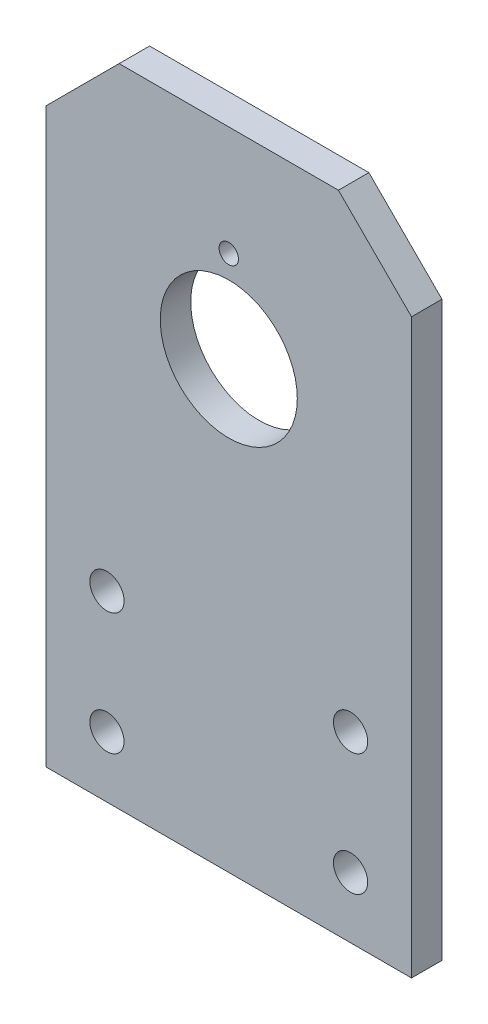
ISO-10303-21;
HEADER;
FILE_DESCRIPTION(('STEP AP214'),'2;1');
FILE_NAME('part.step','',(''),(''),'','','');
FILE_SCHEMA(('AUTOMOTIVE_DESIGN { 1 0 10303 214 1 1 1 1 }'));
ENDSEC;
DATA;
#1=APPLICATION_CONTEXT('core data for automotive mechanical design processes');
#2=APPLICATION_PROTOCOL_DEFINITION('international standard','automotive_design',2000,#1);
#3=PRODUCT_CONTEXT('',#1,'mechanical');
#4=PRODUCT('Part','Part','',(#3));
#5=PRODUCT_RELATED_PRODUCT_CATEGORY('part','',(#4));
#6=PRODUCT_DEFINITION_FORMATION('','',#4);
#7=PRODUCT_DEFINITION_CONTEXT('part definition',#1,'design');
#8=PRODUCT_DEFINITION('design','',#6,#7);
#9=PRODUCT_DEFINITION_SHAPE('','',#8);
#10=(LENGTH_UNIT() NAMED_UNIT(*) SI_UNIT(.MILLI.,.METRE.));
#11=(NAMED_UNIT(*) PLANE_ANGLE_UNIT() SI_UNIT($,.RADIAN.));
#12=(NAMED_UNIT(*) SI_UNIT($,.STERADIAN.) SOLID_ANGLE_UNIT());
#13=UNCERTAINTY_MEASURE_WITH_UNIT(LENGTH_MEASURE(1.E-05),#10,'distance_accuracy_value','');
#14=(GEOMETRIC_REPRESENTATION_CONTEXT(3) GLOBAL_UNCERTAINTY_ASSIGNED_CONTEXT((#13)) GLOBAL_UNIT_ASSIGNED_CONTEXT((#10,
#11,#12)) REPRESENTATION_CONTEXT('',''));
#15=CARTESIAN_POINT('',(0.,0.,0.));
#16=DIRECTION('',(0.,0.,1.));
#17=DIRECTION('',(1.,0.,0.));
#18=AXIS2_PLACEMENT_3D('',#15,#16,#17);
#19=CARTESIAN_POINT('',(0.,0.,6.35));
#20=DIRECTION('',(1.,0.,0.));
#21=DIRECTION('',(0.,1.,0.));
#22=AXIS2_PLACEMENT_3D('',#19,#20,#21);
#23=PLANE('',#22);
#24=DIRECTION('',(0.,-1.,0.));
#25=VECTOR('',#24,1.);
#26=CARTESIAN_POINT('',(0.,0.,6.35));
#27=LINE('',#26,#25);
#28=CARTESIAN_POINT('',(0.,-15.24,6.35));
#29=VERTEX_POINT('',#28);
#30=CARTESIAN_POINT('',(0.,-134.62,6.35));
#31=VERTEX_POINT('',#30);
#32=EDGE_CURVE('E89',#29,#31,#27,.T.);
#33=ORIENTED_EDGE('',*,*,#32,.F.);
#34=DIRECTION('',(0.,0.,-1.));
#35=VECTOR('',#34,1.);
#36=CARTESIAN_POINT('',(0.,-15.24,6.35));
#37=LINE('',#36,#35);
#38=CARTESIAN_POINT('',(0.,-15.24,0.));
#39=VERTEX_POINT('',#38);
#40=EDGE_CURVE('E112',#29,#39,#37,.T.);
#41=ORIENTED_EDGE('',*,*,#40,.T.);
#42=DIRECTION('',(0.,-1.,0.));
#43=VECTOR('',#42,1.);
#44=CARTESIAN_POINT('',(0.,0.,0.));
#45=LINE('',#44,#43);
#46=CARTESIAN_POINT('',(0.,-134.62,0.));
#47=VERTEX_POINT('',#46);
#48=EDGE_CURVE('E110',#39,#47,#45,.T.);
#49=ORIENTED_EDGE('',*,*,#48,.T.);
#50=DIRECTION('',(0.,0.,-1.));
#51=VECTOR('',#50,1.);
#52=CARTESIAN_POINT('',(0.,-134.62,6.35));
#53=LINE('',#52,#51);
#54=EDGE_CURVE('E104',#31,#47,#53,.T.);
#55=ORIENTED_EDGE('',*,*,#54,.F.);
#56=EDGE_LOOP('',(#33,#41,#49,#55));
#57=FACE_BOUND('',#56,.T.);
#58=ADVANCED_FACE('F35',(#57),#23,.F.);
#59=CARTESIAN_POINT('',(0.,-134.62,6.35));
#60=DIRECTION('',(0.,1.,0.));
#61=DIRECTION('',(0.,0.,1.));
#62=AXIS2_PLACEMENT_3D('',#59,#60,#61);
#63=PLANE('',#62);
#64=DIRECTION('',(1.,0.,0.));
#65=VECTOR('',#64,1.);
#66=CARTESIAN_POINT('',(0.,-134.62,0.));
#67=LINE('',#66,#65);
#68=CARTESIAN_POINT('',(76.2,-134.62,0.));
#69=VERTEX_POINT('',#68);
#70=EDGE_CURVE('E139',#47,#69,#67,.T.);
#71=ORIENTED_EDGE('',*,*,#70,.T.);
#72=DIRECTION('',(0.,0.,-1.));
#73=VECTOR('',#72,1.);
#74=CARTESIAN_POINT('',(76.2,-134.62,6.35));
#75=LINE('',#74,#73);
#76=CARTESIAN_POINT('',(76.2,-134.62,6.35));
#77=VERTEX_POINT('',#76);
#78=EDGE_CURVE('E106',#77,#69,#75,.T.);
#79=ORIENTED_EDGE('',*,*,#78,.F.);
#80=DIRECTION('',(1.,0.,0.));
#81=VECTOR('',#80,1.);
#82=CARTESIAN_POINT('',(0.,-134.62,6.35));
#83=LINE('',#82,#81);
#84=EDGE_CURVE('E92',#31,#77,#83,.T.);
#85=ORIENTED_EDGE('',*,*,#84,.F.);
#86=ORIENTED_EDGE('',*,*,#54,.T.);
#87=EDGE_LOOP('',(#71,#79,#85,#86));
#88=FACE_BOUND('',#87,.T.);
#89=ADVANCED_FACE('F103',(#88),#63,.F.);
#90=CARTESIAN_POINT('',(76.2,0.,6.35));
#91=DIRECTION('',(-1.,0.,0.));
#92=DIRECTION('',(0.,0.,1.));
#93=AXIS2_PLACEMENT_3D('',#90,#91,#92);
#94=PLANE('',#93);
#95=DIRECTION('',(0.,1.,0.));
#96=VECTOR('',#95,1.);
#97=CARTESIAN_POINT('',(76.2,0.,0.));
#98=LINE('',#97,#96);
#99=CARTESIAN_POINT('',(76.2,-15.2400000000001,0.));
#100=VERTEX_POINT('',#99);
#101=EDGE_CURVE('E137',#69,#100,#98,.T.);
#102=ORIENTED_EDGE('',*,*,#101,.T.);
#103=DIRECTION('',(0.,0.,1.));
#104=VECTOR('',#103,1.);
#105=CARTESIAN_POINT('',(76.2,-15.2400000000001,6.35));
#106=LINE('',#105,#104);
#107=CARTESIAN_POINT('',(76.2,-15.2400000000001,6.35));
#108=VERTEX_POINT('',#107);
#109=EDGE_CURVE('E11',#100,#108,#106,.T.);
#110=ORIENTED_EDGE('',*,*,#109,.T.);
#111=DIRECTION('',(0.,1.,0.));
#112=VECTOR('',#111,1.);
#113=CARTESIAN_POINT('',(76.2,0.,6.35));
#114=LINE('',#113,#112);
#115=EDGE_CURVE('E107',#77,#108,#114,.T.);
#116=ORIENTED_EDGE('',*,*,#115,.F.);
#117=ORIENTED_EDGE('',*,*,#78,.T.);
#118=EDGE_LOOP('',(#102,#110,#116,#117));
#119=FACE_BOUND('',#118,.T.);
#120=ADVANCED_FACE('F138',(#119),#94,.F.);
#121=CARTESIAN_POINT('',(0.,0.,6.35));
#122=DIRECTION('',(0.,-1.,0.));
#123=DIRECTION('',(0.,0.,-1.));
#124=AXIS2_PLACEMENT_3D('',#121,#122,#123);
#125=PLANE('',#124);
#126=DIRECTION('',(-1.,0.,0.));
#127=VECTOR('',#126,1.);
#128=CARTESIAN_POINT('',(0.,0.,0.));
#129=LINE('',#128,#127);
#130=CARTESIAN_POINT('',(60.96,0.,0.));
#131=VERTEX_POINT('',#130);
#132=CARTESIAN_POINT('',(15.2400000000001,0.,0.));
#133=VERTEX_POINT('',#132);
#134=EDGE_CURVE('E99',#131,#133,#129,.T.);
#135=ORIENTED_EDGE('',*,*,#134,.T.);
#136=DIRECTION('',(0.,0.,1.));
#137=VECTOR('',#136,1.);
#138=CARTESIAN_POINT('',(15.2400000000001,0.,6.35));
#139=LINE('',#138,#137);
#140=CARTESIAN_POINT('',(15.2400000000001,0.,6.35));
#141=VERTEX_POINT('',#140);
#142=EDGE_CURVE('E56',#133,#141,#139,.T.);
#143=ORIENTED_EDGE('',*,*,#142,.T.);
#144=DIRECTION('',(-1.,0.,0.));
#145=VECTOR('',#144,1.);
#146=CARTESIAN_POINT('',(0.,0.,6.35));
#147=LINE('',#146,#145);
#148=CARTESIAN_POINT('',(60.96,0.,6.35));
#149=VERTEX_POINT('',#148);
#150=EDGE_CURVE('E116',#149,#141,#147,.T.);
#151=ORIENTED_EDGE('',*,*,#150,.F.);
#152=DIRECTION('',(0.,0.,-1.));
#153=VECTOR('',#152,1.);
#154=CARTESIAN_POINT('',(60.96,0.,6.35));
#155=LINE('',#154,#153);
#156=EDGE_CURVE('E123',#149,#131,#155,.T.);
#157=ORIENTED_EDGE('',*,*,#156,.T.);
#158=EDGE_LOOP('',(#135,#143,#151,#157));
#159=FACE_BOUND('',#158,.T.);
#160=ADVANCED_FACE('F131',(#159),#125,.F.);
#161=CARTESIAN_POINT('',(0.,0.,6.35));
#162=DIRECTION('',(0.,0.,1.));
#163=DIRECTION('',(1.,0.,0.));
#164=AXIS2_PLACEMENT_3D('',#161,#162,#163);
#165=PLANE('',#164);
#166=CARTESIAN_POINT('',(38.1,-22.86,6.35));
#167=DIRECTION('',(0.,0.,1.));
#168=DIRECTION('',(1.,0.,0.));
#169=AXIS2_PLACEMENT_3D('',#166,#167,#168);
#170=CIRCLE('',#169,2.01929999999999);
#171=CARTESIAN_POINT('',(40.1193,-22.86,6.35));
#172=VERTEX_POINT('',#171);
#173=EDGE_CURVE('E178',#172,#172,#170,.T.);
#174=ORIENTED_EDGE('',*,*,#173,.F.);
#175=EDGE_LOOP('',(#174));
#176=FACE_BOUND('',#175,.T.);
#177=CARTESIAN_POINT('',(63.5,-121.92,6.35));
#178=DIRECTION('',(0.,0.,1.));
#179=DIRECTION('',(1.,0.,0.));
#180=AXIS2_PLACEMENT_3D('',#177,#178,#179);
#181=CIRCLE('',#180,3.57187500000001);
#182=CARTESIAN_POINT('',(67.071875,-121.92,6.35));
#183=VERTEX_POINT('',#182);
#184=EDGE_CURVE('E171',#183,#183,#181,.T.);
#185=ORIENTED_EDGE('',*,*,#184,.F.);
#186=EDGE_LOOP('',(#185));
#187=FACE_BOUND('',#186,.T.);
#188=CARTESIAN_POINT('',(12.7,-96.52,6.35));
#189=DIRECTION('',(0.,0.,1.));
#190=DIRECTION('',(1.,0.,0.));
#191=AXIS2_PLACEMENT_3D('',#188,#189,#190);
#192=CIRCLE('',#191,3.57187499999999);
#193=CARTESIAN_POINT('',(16.271875,-96.52,6.35));
#194=VERTEX_POINT('',#193);
#195=EDGE_CURVE('E165',#194,#194,#192,.T.);
#196=ORIENTED_EDGE('',*,*,#195,.F.);
#197=EDGE_LOOP('',(#196));
#198=FACE_BOUND('',#197,.T.);
#199=CARTESIAN_POINT('',(63.5,-96.52,6.35));
#200=DIRECTION('',(0.,0.,1.));
#201=DIRECTION('',(1.,0.,0.));
#202=AXIS2_PLACEMENT_3D('',#199,#200,#201);
#203=CIRCLE('',#202,3.57187500000001);
#204=CARTESIAN_POINT('',(67.071875,-96.52,6.35));
#205=VERTEX_POINT('',#204);
#206=EDGE_CURVE('E158',#205,#205,#203,.T.);
#207=ORIENTED_EDGE('',*,*,#206,.F.);
#208=EDGE_LOOP('',(#207));
#209=FACE_BOUND('',#208,.T.);
#210=CARTESIAN_POINT('',(12.7,-121.92,6.35));
#211=DIRECTION('',(0.,0.,1.));
#212=DIRECTION('',(1.,0.,0.));
#213=AXIS2_PLACEMENT_3D('',#210,#211,#212);
#214=CIRCLE('',#213,3.57187499999999);
#215=CARTESIAN_POINT('',(16.271875,-121.92,6.35));
#216=VERTEX_POINT('',#215);
#217=EDGE_CURVE('E152',#216,#216,#214,.T.);
#218=ORIENTED_EDGE('',*,*,#217,.F.);
#219=EDGE_LOOP('',(#218));
#220=FACE_BOUND('',#219,.T.);
#221=CARTESIAN_POINT('',(38.1,-41.91,6.35));
#222=DIRECTION('',(0.,0.,1.));
#223=DIRECTION('',(1.,0.,0.));
#224=AXIS2_PLACEMENT_3D('',#221,#222,#223);
#225=CIRCLE('',#224,14.2875);
#226=CARTESIAN_POINT('',(52.3875,-41.91,6.35));
#227=VERTEX_POINT('',#226);
#228=EDGE_CURVE('E146',#227,#227,#225,.T.);
#229=ORIENTED_EDGE('',*,*,#228,.F.);
#230=EDGE_LOOP('',(#229));
#231=FACE_BOUND('',#230,.T.);
#232=ORIENTED_EDGE('',*,*,#150,.T.);
#233=DIRECTION('',(0.707106781186548,0.707106781186547,0.));
#234=VECTOR('',#233,1.);
#235=CARTESIAN_POINT('',(7.62000000000001,-7.62000000000003,6.35));
#236=LINE('',#235,#234);
#237=EDGE_CURVE('E43',#141,#29,#236,.F.);
#238=ORIENTED_EDGE('',*,*,#237,.T.);
#239=ORIENTED_EDGE('',*,*,#32,.T.);
#240=ORIENTED_EDGE('',*,*,#84,.T.);
#241=ORIENTED_EDGE('',*,*,#115,.T.);
#242=DIRECTION('',(0.707106781186547,-0.707106781186548,0.));
#243=VECTOR('',#242,1.);
#244=CARTESIAN_POINT('',(30.4800000000001,30.48,6.35));
#245=LINE('',#244,#243);
#246=EDGE_CURVE('E127',#108,#149,#245,.F.);
#247=ORIENTED_EDGE('',*,*,#246,.T.);
#248=EDGE_LOOP('',(#232,#238,#239,#240,#241,#247));
#249=FACE_BOUND('',#248,.T.);
#250=ADVANCED_FACE('F91',(#176,#187,#198,#209,#220,#231,#249),#165,.T.);
#251=CARTESIAN_POINT('',(0.,0.,0.));
#252=DIRECTION('',(0.,0.,1.));
#253=DIRECTION('',(1.,0.,0.));
#254=AXIS2_PLACEMENT_3D('',#251,#252,#253);
#255=PLANE('',#254);
#256=CARTESIAN_POINT('',(38.1,-22.86,0.));
#257=DIRECTION('',(0.,0.,1.));
#258=DIRECTION('',(1.,0.,0.));
#259=AXIS2_PLACEMENT_3D('',#256,#257,#258);
#260=CIRCLE('',#259,2.01929999999999);
#261=CARTESIAN_POINT('',(40.1193,-22.86,0.));
#262=VERTEX_POINT('',#261);
#263=EDGE_CURVE('E162',#262,#262,#260,.T.);
#264=ORIENTED_EDGE('',*,*,#263,.T.);
#265=EDGE_LOOP('',(#264));
#266=FACE_BOUND('',#265,.T.);
#267=CARTESIAN_POINT('',(63.5,-121.92,0.));
#268=DIRECTION('',(0.,0.,1.));
#269=DIRECTION('',(1.,0.,0.));
#270=AXIS2_PLACEMENT_3D('',#267,#268,#269);
#271=CIRCLE('',#270,3.57187500000001);
#272=CARTESIAN_POINT('',(67.071875,-121.92,0.));
#273=VERTEX_POINT('',#272);
#274=EDGE_CURVE('E155',#273,#273,#271,.T.);
#275=ORIENTED_EDGE('',*,*,#274,.T.);
#276=EDGE_LOOP('',(#275));
#277=FACE_BOUND('',#276,.T.);
#278=CARTESIAN_POINT('',(12.7,-96.52,0.));
#279=DIRECTION('',(0.,0.,1.));
#280=DIRECTION('',(1.,0.,0.));
#281=AXIS2_PLACEMENT_3D('',#278,#279,#280);
#282=CIRCLE('',#281,3.57187499999999);
#283=CARTESIAN_POINT('',(16.271875,-96.52,0.));
#284=VERTEX_POINT('',#283);
#285=EDGE_CURVE('E168',#284,#284,#282,.T.);
#286=ORIENTED_EDGE('',*,*,#285,.T.);
#287=EDGE_LOOP('',(#286));
#288=FACE_BOUND('',#287,.T.);
#289=CARTESIAN_POINT('',(63.5,-96.52,0.));
#290=DIRECTION('',(0.,0.,1.));
#291=DIRECTION('',(1.,0.,0.));
#292=AXIS2_PLACEMENT_3D('',#289,#290,#291);
#293=CIRCLE('',#292,3.57187500000001);
#294=CARTESIAN_POINT('',(67.071875,-96.52,0.));
#295=VERTEX_POINT('',#294);
#296=EDGE_CURVE('E161',#295,#295,#293,.T.);
#297=ORIENTED_EDGE('',*,*,#296,.T.);
#298=EDGE_LOOP('',(#297));
#299=FACE_BOUND('',#298,.T.);
#300=CARTESIAN_POINT('',(12.7,-121.92,0.));
#301=DIRECTION('',(0.,0.,1.));
#302=DIRECTION('',(1.,0.,0.));
#303=AXIS2_PLACEMENT_3D('',#300,#301,#302);
#304=CIRCLE('',#303,3.57187499999999);
#305=CARTESIAN_POINT('',(16.271875,-121.92,0.));
#306=VERTEX_POINT('',#305);
#307=EDGE_CURVE('E149',#306,#306,#304,.T.);
#308=ORIENTED_EDGE('',*,*,#307,.T.);
#309=EDGE_LOOP('',(#308));
#310=FACE_BOUND('',#309,.T.);
#311=CARTESIAN_POINT('',(38.1,-41.91,0.));
#312=DIRECTION('',(0.,0.,1.));
#313=DIRECTION('',(1.,0.,0.));
#314=AXIS2_PLACEMENT_3D('',#311,#312,#313);
#315=CIRCLE('',#314,14.2875);
#316=CARTESIAN_POINT('',(52.3875,-41.91,0.));
#317=VERTEX_POINT('',#316);
#318=EDGE_CURVE('E143',#317,#317,#315,.T.);
#319=ORIENTED_EDGE('',*,*,#318,.T.);
#320=EDGE_LOOP('',(#319));
#321=FACE_BOUND('',#320,.T.);
#322=ORIENTED_EDGE('',*,*,#48,.F.);
#323=DIRECTION('',(-0.707106781186548,-0.707106781186547,0.));
#324=VECTOR('',#323,1.);
#325=CARTESIAN_POINT('',(0.,-15.24,0.));
#326=LINE('',#325,#324);
#327=EDGE_CURVE('E121',#39,#133,#326,.F.);
#328=ORIENTED_EDGE('',*,*,#327,.T.);
#329=ORIENTED_EDGE('',*,*,#134,.F.);
#330=DIRECTION('',(-0.707106781186547,0.707106781186548,0.));
#331=VECTOR('',#330,1.);
#332=CARTESIAN_POINT('',(60.96,0.,0.));
#333=LINE('',#332,#331);
#334=EDGE_CURVE('E114',#131,#100,#333,.F.);
#335=ORIENTED_EDGE('',*,*,#334,.T.);
#336=ORIENTED_EDGE('',*,*,#101,.F.);
#337=ORIENTED_EDGE('',*,*,#70,.F.);
#338=EDGE_LOOP('',(#322,#328,#329,#335,#336,#337));
#339=FACE_BOUND('',#338,.T.);
#340=ADVANCED_FACE('F136',(#266,#277,#288,#299,#310,#321,#339),#255,.F.);
#341=CARTESIAN_POINT('',(38.1,-41.91,0.));
#342=DIRECTION('',(0.,0.,1.));
#343=DIRECTION('',(1.,0.,0.));
#344=AXIS2_PLACEMENT_3D('',#341,#342,#343);
#345=CYLINDRICAL_SURFACE('',#344,14.2875);
#346=ORIENTED_EDGE('',*,*,#318,.F.);
#347=EDGE_LOOP('',(#346));
#348=FACE_BOUND('',#347,.T.);
#349=ORIENTED_EDGE('',*,*,#228,.T.);
#350=EDGE_LOOP('',(#349));
#351=FACE_BOUND('',#350,.T.);
#352=ADVANCED_FACE('F197',(#348,#351),#345,.F.);
#353=CARTESIAN_POINT('',(12.7,-121.92,0.));
#354=DIRECTION('',(0.,0.,1.));
#355=DIRECTION('',(1.,0.,0.));
#356=AXIS2_PLACEMENT_3D('',#353,#354,#355);
#357=CYLINDRICAL_SURFACE('',#356,3.57187499999999);
#358=ORIENTED_EDGE('',*,*,#307,.F.);
#359=EDGE_LOOP('',(#358));
#360=FACE_BOUND('',#359,.T.);
#361=ORIENTED_EDGE('',*,*,#217,.T.);
#362=EDGE_LOOP('',(#361));
#363=FACE_BOUND('',#362,.T.);
#364=ADVANCED_FACE('F199',(#360,#363),#357,.F.);
#365=CARTESIAN_POINT('',(63.5,-96.52,0.));
#366=DIRECTION('',(0.,0.,1.));
#367=DIRECTION('',(1.,0.,0.));
#368=AXIS2_PLACEMENT_3D('',#365,#366,#367);
#369=CYLINDRICAL_SURFACE('',#368,3.57187500000001);
#370=ORIENTED_EDGE('',*,*,#296,.F.);
#371=EDGE_LOOP('',(#370));
#372=FACE_BOUND('',#371,.T.);
#373=ORIENTED_EDGE('',*,*,#206,.T.);
#374=EDGE_LOOP('',(#373));
#375=FACE_BOUND('',#374,.T.);
#376=ADVANCED_FACE('F206',(#372,#375),#369,.F.);
#377=CARTESIAN_POINT('',(12.7,-96.52,0.));
#378=DIRECTION('',(0.,0.,1.));
#379=DIRECTION('',(1.,0.,0.));
#380=AXIS2_PLACEMENT_3D('',#377,#378,#379);
#381=CYLINDRICAL_SURFACE('',#380,3.57187499999999);
#382=ORIENTED_EDGE('',*,*,#285,.F.);
#383=EDGE_LOOP('',(#382));
#384=FACE_BOUND('',#383,.T.);
#385=ORIENTED_EDGE('',*,*,#195,.T.);
#386=EDGE_LOOP('',(#385));
#387=FACE_BOUND('',#386,.T.);
#388=ADVANCED_FACE('F227',(#384,#387),#381,.F.);
#389=CARTESIAN_POINT('',(63.5,-121.92,0.));
#390=DIRECTION('',(0.,0.,1.));
#391=DIRECTION('',(1.,0.,0.));
#392=AXIS2_PLACEMENT_3D('',#389,#390,#391);
#393=CYLINDRICAL_SURFACE('',#392,3.57187500000001);
#394=ORIENTED_EDGE('',*,*,#274,.F.);
#395=EDGE_LOOP('',(#394));
#396=FACE_BOUND('',#395,.T.);
#397=ORIENTED_EDGE('',*,*,#184,.T.);
#398=EDGE_LOOP('',(#397));
#399=FACE_BOUND('',#398,.T.);
#400=ADVANCED_FACE('F221',(#396,#399),#393,.F.);
#401=CARTESIAN_POINT('',(0.,-15.24,6.35));
#402=DIRECTION('',(0.707106781186547,-0.707106781186548,0.));
#403=DIRECTION('',(0.,0.,-1.));
#404=AXIS2_PLACEMENT_3D('',#401,#402,#403);
#405=PLANE('',#404);
#406=ORIENTED_EDGE('',*,*,#237,.F.);
#407=ORIENTED_EDGE('',*,*,#142,.F.);
#408=ORIENTED_EDGE('',*,*,#327,.F.);
#409=ORIENTED_EDGE('',*,*,#40,.F.);
#410=EDGE_LOOP('',(#406,#407,#408,#409));
#411=FACE_BOUND('',#410,.T.);
#412=ADVANCED_FACE('F219',(#411),#405,.F.);
#413=CARTESIAN_POINT('',(60.96,0.,6.35));
#414=DIRECTION('',(-0.707106781186548,-0.707106781186547,0.));
#415=DIRECTION('',(0.,0.,-1.));
#416=AXIS2_PLACEMENT_3D('',#413,#414,#415);
#417=PLANE('',#416);
#418=ORIENTED_EDGE('',*,*,#246,.F.);
#419=ORIENTED_EDGE('',*,*,#109,.F.);
#420=ORIENTED_EDGE('',*,*,#334,.F.);
#421=ORIENTED_EDGE('',*,*,#156,.F.);
#422=EDGE_LOOP('',(#418,#419,#420,#421));
#423=FACE_BOUND('',#422,.T.);
#424=ADVANCED_FACE('F37',(#423),#417,.F.);
#425=CARTESIAN_POINT('',(38.1,-22.86,6.35));
#426=DIRECTION('',(0.,0.,1.));
#427=DIRECTION('',(1.,0.,0.));
#428=AXIS2_PLACEMENT_3D('',#425,#426,#427);
#429=CYLINDRICAL_SURFACE('',#428,2.01929999999999);
#430=ORIENTED_EDGE('',*,*,#263,.F.);
#431=EDGE_LOOP('',(#430));
#432=FACE_BOUND('',#431,.T.);
#433=ORIENTED_EDGE('',*,*,#173,.T.);
#434=EDGE_LOOP('',(#433));
#435=FACE_BOUND('',#434,.T.);
#436=ADVANCED_FACE('F182',(#432,#435),#429,.F.);
#437=CLOSED_SHELL('',(#58,#89,#120,#160,#250,#340,#352,#364,#376,#388,#400,#412,#424,#436));
#438=MANIFOLD_SOLID_BREP('B2',#437);
#439=ADVANCED_BREP_SHAPE_REPRESENTATION('',(#18,#438),#14);
#440=SHAPE_DEFINITION_REPRESENTATION(#9,#439);
ENDSEC;
END-ISO-10303-21;
